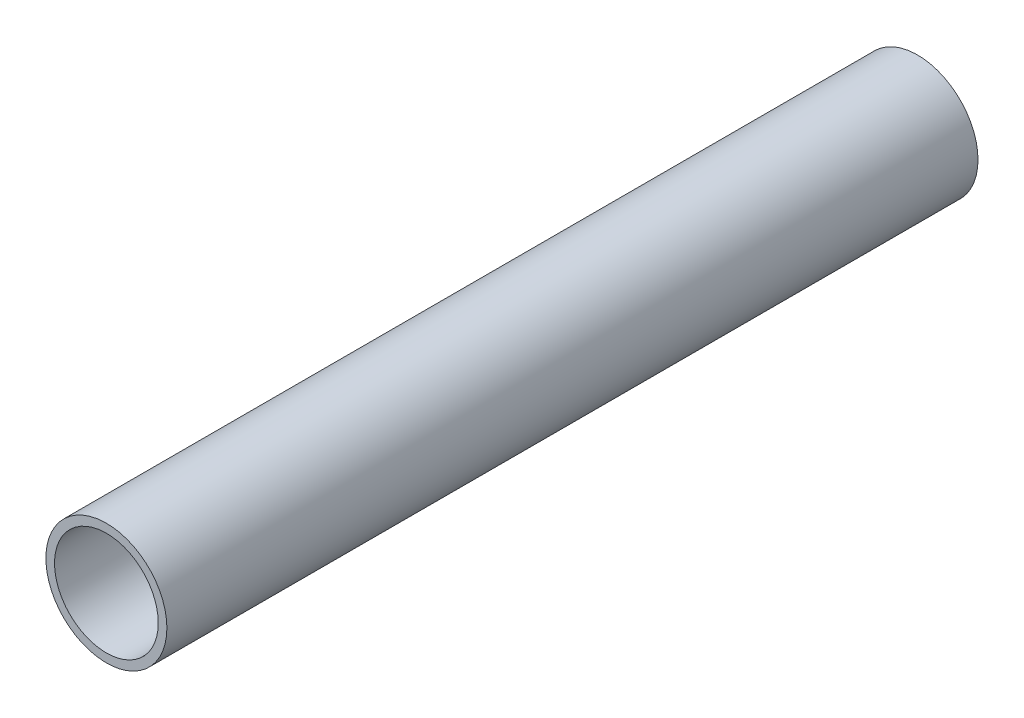
ISO-10303-21;
HEADER;
FILE_DESCRIPTION(('STEP AP214'),'2;1');
FILE_NAME('part.step','',(''),(''),'','','');
FILE_SCHEMA(('AUTOMOTIVE_DESIGN { 1 0 10303 214 1 1 1 1 }'));
ENDSEC;
DATA;
#1=APPLICATION_CONTEXT('core data for automotive mechanical design processes');
#2=APPLICATION_PROTOCOL_DEFINITION('international standard','automotive_design',2000,#1);
#3=PRODUCT_CONTEXT('',#1,'mechanical');
#4=PRODUCT('Part','Part','',(#3));
#5=PRODUCT_RELATED_PRODUCT_CATEGORY('part','',(#4));
#6=PRODUCT_DEFINITION_FORMATION('','',#4);
#7=PRODUCT_DEFINITION_CONTEXT('part definition',#1,'design');
#8=PRODUCT_DEFINITION('design','',#6,#7);
#9=PRODUCT_DEFINITION_SHAPE('','',#8);
#10=(LENGTH_UNIT() NAMED_UNIT(*) SI_UNIT(.MILLI.,.METRE.));
#11=(NAMED_UNIT(*) PLANE_ANGLE_UNIT() SI_UNIT($,.RADIAN.));
#12=(NAMED_UNIT(*) SI_UNIT($,.STERADIAN.) SOLID_ANGLE_UNIT());
#13=UNCERTAINTY_MEASURE_WITH_UNIT(LENGTH_MEASURE(1.E-05),#10,'distance_accuracy_value','');
#14=(GEOMETRIC_REPRESENTATION_CONTEXT(3) GLOBAL_UNCERTAINTY_ASSIGNED_CONTEXT((#13)) GLOBAL_UNIT_ASSIGNED_CONTEXT((#10,
#11,#12)) REPRESENTATION_CONTEXT('',''));
#15=CARTESIAN_POINT('',(0.,0.,0.));
#16=DIRECTION('',(0.,0.,1.));
#17=DIRECTION('',(1.,0.,0.));
#18=AXIS2_PLACEMENT_3D('',#15,#16,#17);
#19=CARTESIAN_POINT('',(0.,0.,74.4855));
#20=DIRECTION('',(0.,0.,1.));
#21=DIRECTION('',(1.,0.,0.));
#22=AXIS2_PLACEMENT_3D('',#19,#20,#21);
#23=PLANE('',#22);
#24=CARTESIAN_POINT('',(0.,0.,74.4855));
#25=DIRECTION('',(0.,0.,1.));
#26=DIRECTION('',(1.,0.,0.));
#27=AXIS2_PLACEMENT_3D('',#24,#25,#26);
#28=CIRCLE('',#27,11.1125);
#29=CARTESIAN_POINT('',(11.1125,0.,74.4855));
#30=VERTEX_POINT('',#29);
#31=EDGE_CURVE('E10',#30,#30,#28,.T.);
#32=ORIENTED_EDGE('',*,*,#31,.T.);
#33=EDGE_LOOP('',(#32));
#34=FACE_BOUND('',#33,.T.);
#35=CARTESIAN_POINT('',(0.,0.,74.4855));
#36=DIRECTION('',(0.,0.,1.));
#37=DIRECTION('',(1.,0.,0.));
#38=AXIS2_PLACEMENT_3D('',#35,#36,#37);
#39=CIRCLE('',#38,9.525);
#40=CARTESIAN_POINT('',(9.525,0.,74.4855));
#41=VERTEX_POINT('',#40);
#42=EDGE_CURVE('E43',#41,#41,#39,.T.);
#43=ORIENTED_EDGE('',*,*,#42,.F.);
#44=EDGE_LOOP('',(#43));
#45=FACE_BOUND('',#44,.T.);
#46=ADVANCED_FACE('F32',(#34,#45),#23,.T.);
#47=CARTESIAN_POINT('',(0.,0.,-74.4855));
#48=DIRECTION('',(0.,0.,1.));
#49=DIRECTION('',(1.,0.,0.));
#50=AXIS2_PLACEMENT_3D('',#47,#48,#49);
#51=PLANE('',#50);
#52=CARTESIAN_POINT('',(0.,0.,-74.4855));
#53=DIRECTION('',(0.,0.,1.));
#54=DIRECTION('',(1.,0.,0.));
#55=AXIS2_PLACEMENT_3D('',#52,#53,#54);
#56=CIRCLE('',#55,11.1125);
#57=CARTESIAN_POINT('',(11.1125,0.,-74.4855));
#58=VERTEX_POINT('',#57);
#59=EDGE_CURVE('E36',#58,#58,#56,.T.);
#60=ORIENTED_EDGE('',*,*,#59,.F.);
#61=EDGE_LOOP('',(#60));
#62=FACE_BOUND('',#61,.T.);
#63=CARTESIAN_POINT('',(0.,0.,-74.4855));
#64=DIRECTION('',(0.,0.,1.));
#65=DIRECTION('',(1.,0.,0.));
#66=AXIS2_PLACEMENT_3D('',#63,#64,#65);
#67=CIRCLE('',#66,9.525);
#68=CARTESIAN_POINT('',(9.525,0.,-74.4855));
#69=VERTEX_POINT('',#68);
#70=EDGE_CURVE('E45',#69,#69,#67,.T.);
#71=ORIENTED_EDGE('',*,*,#70,.T.);
#72=EDGE_LOOP('',(#71));
#73=FACE_BOUND('',#72,.T.);
#74=ADVANCED_FACE('F55',(#62,#73),#51,.F.);
#75=CARTESIAN_POINT('',(0.,0.,74.4855));
#76=DIRECTION('',(0.,0.,-1.));
#77=DIRECTION('',(-1.,0.,0.));
#78=AXIS2_PLACEMENT_3D('',#75,#76,#77);
#79=CYLINDRICAL_SURFACE('',#78,11.1125);
#80=ORIENTED_EDGE('',*,*,#31,.F.);
#81=EDGE_LOOP('',(#80));
#82=FACE_BOUND('',#81,.T.);
#83=ORIENTED_EDGE('',*,*,#59,.T.);
#84=EDGE_LOOP('',(#83));
#85=FACE_BOUND('',#84,.T.);
#86=ADVANCED_FACE('F34',(#82,#85),#79,.T.);
#87=CARTESIAN_POINT('',(0.,0.,74.4855));
#88=DIRECTION('',(0.,0.,-1.));
#89=DIRECTION('',(-1.,0.,0.));
#90=AXIS2_PLACEMENT_3D('',#87,#88,#89);
#91=CYLINDRICAL_SURFACE('',#90,9.525);
#92=ORIENTED_EDGE('',*,*,#42,.T.);
#93=EDGE_LOOP('',(#92));
#94=FACE_BOUND('',#93,.T.);
#95=ORIENTED_EDGE('',*,*,#70,.F.);
#96=EDGE_LOOP('',(#95));
#97=FACE_BOUND('',#96,.T.);
#98=ADVANCED_FACE('F51',(#94,#97),#91,.F.);
#99=CLOSED_SHELL('',(#46,#74,#86,#98));
#100=MANIFOLD_SOLID_BREP('B2',#99);
#101=ADVANCED_BREP_SHAPE_REPRESENTATION('',(#18,#100),#14);
#102=SHAPE_DEFINITION_REPRESENTATION(#9,#101);
ENDSEC;
END-ISO-10303-21;
